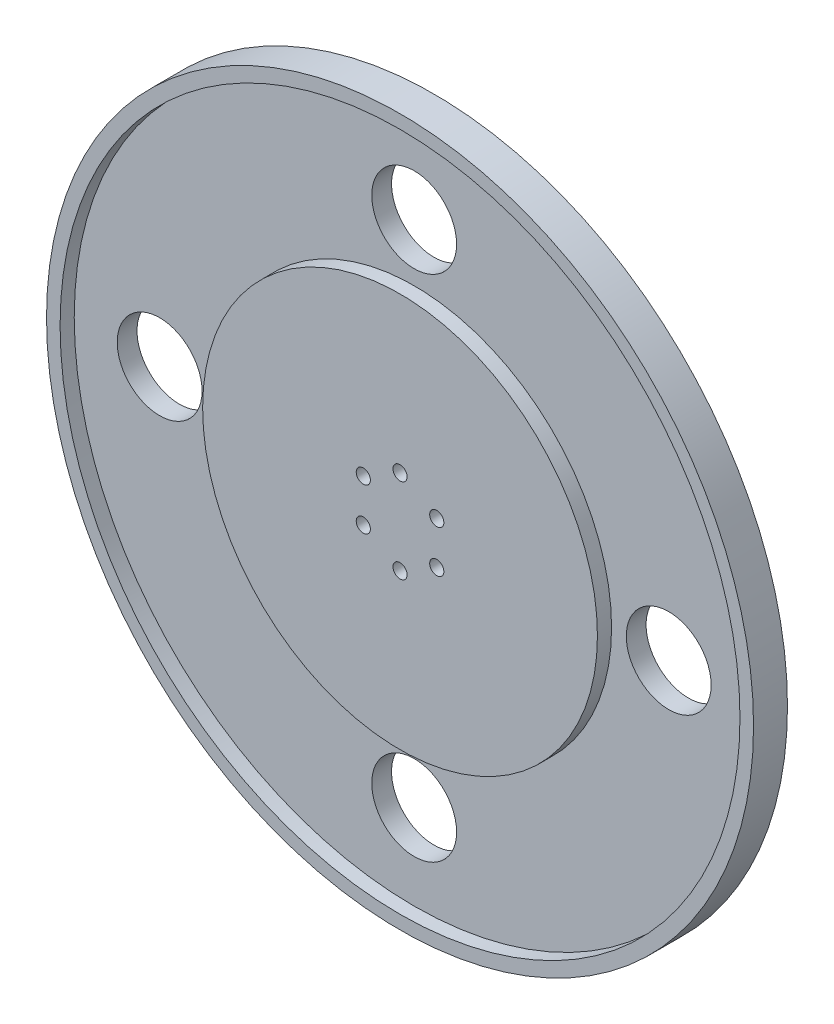
ISO-10303-21;
HEADER;
FILE_DESCRIPTION(('STEP AP214'),'2;1');
FILE_NAME('part.step','',(''),(''),'','','');
FILE_SCHEMA(('AUTOMOTIVE_DESIGN { 1 0 10303 214 1 1 1 1 }'));
ENDSEC;
DATA;
#1=APPLICATION_CONTEXT('core data for automotive mechanical design processes');
#2=APPLICATION_PROTOCOL_DEFINITION('international standard','automotive_design',2000,#1);
#3=PRODUCT_CONTEXT('',#1,'mechanical');
#4=PRODUCT('Part','Part','',(#3));
#5=PRODUCT_RELATED_PRODUCT_CATEGORY('part','',(#4));
#6=PRODUCT_DEFINITION_FORMATION('','',#4);
#7=PRODUCT_DEFINITION_CONTEXT('part definition',#1,'design');
#8=PRODUCT_DEFINITION('design','',#6,#7);
#9=PRODUCT_DEFINITION_SHAPE('','',#8);
#10=(LENGTH_UNIT() NAMED_UNIT(*) SI_UNIT(.MILLI.,.METRE.));
#11=(NAMED_UNIT(*) PLANE_ANGLE_UNIT() SI_UNIT($,.RADIAN.));
#12=(NAMED_UNIT(*) SI_UNIT($,.STERADIAN.) SOLID_ANGLE_UNIT());
#13=UNCERTAINTY_MEASURE_WITH_UNIT(LENGTH_MEASURE(1.E-05),#10,'distance_accuracy_value','');
#14=(GEOMETRIC_REPRESENTATION_CONTEXT(3) GLOBAL_UNCERTAINTY_ASSIGNED_CONTEXT((#13)) GLOBAL_UNIT_ASSIGNED_CONTEXT((#10,
#11,#12)) REPRESENTATION_CONTEXT('',''));
#15=CARTESIAN_POINT('',(0.,0.,0.));
#16=DIRECTION('',(0.,0.,1.));
#17=DIRECTION('',(1.,0.,0.));
#18=AXIS2_PLACEMENT_3D('',#15,#16,#17);
#19=CARTESIAN_POINT('',(0.,0.,7.62));
#20=DIRECTION('',(0.,0.,-1.));
#21=DIRECTION('',(-1.,0.,0.));
#22=AXIS2_PLACEMENT_3D('',#19,#20,#21);
#23=CYLINDRICAL_SURFACE('',#22,44.323);
#24=CARTESIAN_POINT('',(0.,0.,4.445));
#25=DIRECTION('',(0.,0.,1.));
#26=DIRECTION('',(1.,0.,0.));
#27=AXIS2_PLACEMENT_3D('',#24,#25,#26);
#28=CIRCLE('',#27,44.323);
#29=CARTESIAN_POINT('',(-44.323,0.,4.445));
#30=VERTEX_POINT('',#29);
#31=EDGE_CURVE('E49',#30,#30,#28,.T.);
#32=CARTESIAN_POINT('',(0.,0.,7.62));
#33=DIRECTION('',(0.,0.,1.));
#34=DIRECTION('',(1.,0.,0.));
#35=AXIS2_PLACEMENT_3D('',#32,#33,#34);
#36=CIRCLE('',#35,44.323);
#37=CARTESIAN_POINT('',(-44.323,0.,7.62));
#38=VERTEX_POINT('',#37);
#39=EDGE_CURVE('E11',#38,#38,#36,.T.);
#40=CARTESIAN_POINT('',(-44.323,0.,4.445));
#41=CARTESIAN_POINT('',(-44.323,0.,4.47807291666667));
#42=CARTESIAN_POINT('',(-44.323,0.,4.51114583333333));
#43=CARTESIAN_POINT('',(-44.323,0.,4.57729166666667));
#44=CARTESIAN_POINT('',(-44.323,0.,4.61036458333333));
#45=CARTESIAN_POINT('',(-44.323,0.,4.67651041666667));
#46=CARTESIAN_POINT('',(-44.323,0.,4.70958333333333));
#47=CARTESIAN_POINT('',(-44.323,0.,4.77572916666667));
#48=CARTESIAN_POINT('',(-44.323,0.,4.80880208333333));
#49=CARTESIAN_POINT('',(-44.323,0.,4.87494791666667));
#50=CARTESIAN_POINT('',(-44.323,0.,4.90802083333333));
#51=CARTESIAN_POINT('',(-44.323,0.,4.97416666666667));
#52=CARTESIAN_POINT('',(-44.323,0.,5.00723958333333));
#53=CARTESIAN_POINT('',(-44.323,0.,5.07338541666667));
#54=CARTESIAN_POINT('',(-44.323,0.,5.10645833333333));
#55=CARTESIAN_POINT('',(-44.323,0.,5.17260416666667));
#56=CARTESIAN_POINT('',(-44.323,0.,5.20567708333333));
#57=CARTESIAN_POINT('',(-44.323,0.,5.27182291666667));
#58=CARTESIAN_POINT('',(-44.323,0.,5.30489583333333));
#59=CARTESIAN_POINT('',(-44.323,0.,5.37104166666667));
#60=CARTESIAN_POINT('',(-44.323,0.,5.40411458333333));
#61=CARTESIAN_POINT('',(-44.323,0.,5.47026041666667));
#62=CARTESIAN_POINT('',(-44.323,0.,5.50333333333333));
#63=CARTESIAN_POINT('',(-44.323,0.,5.56947916666667));
#64=CARTESIAN_POINT('',(-44.323,0.,5.60255208333333));
#65=CARTESIAN_POINT('',(-44.323,0.,5.66869791666667));
#66=CARTESIAN_POINT('',(-44.323,0.,5.70177083333333));
#67=CARTESIAN_POINT('',(-44.323,0.,5.76791666666667));
#68=CARTESIAN_POINT('',(-44.323,0.,5.80098958333333));
#69=CARTESIAN_POINT('',(-44.323,0.,5.86713541666667));
#70=CARTESIAN_POINT('',(-44.323,0.,5.90020833333333));
#71=CARTESIAN_POINT('',(-44.323,0.,5.96635416666667));
#72=CARTESIAN_POINT('',(-44.323,0.,5.99942708333333));
#73=CARTESIAN_POINT('',(-44.323,0.,6.06557291666667));
#74=CARTESIAN_POINT('',(-44.323,0.,6.09864583333333));
#75=CARTESIAN_POINT('',(-44.323,0.,6.16479166666667));
#76=CARTESIAN_POINT('',(-44.323,0.,6.19786458333333));
#77=CARTESIAN_POINT('',(-44.323,0.,6.26401041666667));
#78=CARTESIAN_POINT('',(-44.323,0.,6.29708333333333));
#79=CARTESIAN_POINT('',(-44.323,0.,6.36322916666667));
#80=CARTESIAN_POINT('',(-44.323,0.,6.39630208333333));
#81=CARTESIAN_POINT('',(-44.323,0.,6.46244791666667));
#82=CARTESIAN_POINT('',(-44.323,0.,6.49552083333333));
#83=CARTESIAN_POINT('',(-44.323,0.,6.56166666666667));
#84=CARTESIAN_POINT('',(-44.323,0.,6.59473958333333));
#85=CARTESIAN_POINT('',(-44.323,0.,6.66088541666667));
#86=CARTESIAN_POINT('',(-44.323,0.,6.69395833333333));
#87=CARTESIAN_POINT('',(-44.323,0.,6.76010416666667));
#88=CARTESIAN_POINT('',(-44.323,0.,6.79317708333333));
#89=CARTESIAN_POINT('',(-44.323,0.,6.85932291666667));
#90=CARTESIAN_POINT('',(-44.323,0.,6.89239583333333));
#91=CARTESIAN_POINT('',(-44.323,0.,6.95854166666667));
#92=CARTESIAN_POINT('',(-44.323,0.,6.99161458333333));
#93=CARTESIAN_POINT('',(-44.323,0.,7.05776041666667));
#94=CARTESIAN_POINT('',(-44.323,0.,7.09083333333333));
#95=CARTESIAN_POINT('',(-44.323,0.,7.15697916666667));
#96=CARTESIAN_POINT('',(-44.323,0.,7.19005208333333));
#97=CARTESIAN_POINT('',(-44.323,0.,7.25619791666667));
#98=CARTESIAN_POINT('',(-44.323,0.,7.28927083333333));
#99=CARTESIAN_POINT('',(-44.323,0.,7.35541666666667));
#100=CARTESIAN_POINT('',(-44.323,0.,7.38848958333333));
#101=CARTESIAN_POINT('',(-44.323,0.,7.45463541666667));
#102=CARTESIAN_POINT('',(-44.323,0.,7.48770833333333));
#103=CARTESIAN_POINT('',(-44.323,0.,7.55385416666667));
#104=CARTESIAN_POINT('',(-44.323,0.,7.58692708333333));
#105=CARTESIAN_POINT('',(-44.323,0.,7.62));
#106=B_SPLINE_CURVE_WITH_KNOTS('',3,(#40,#41,#42,#43,#44,#45,#46,#47,#48,#49,#50,#51,#52,#53,
#54,#55,#56,#57,#58,#59,#60,#61,#62,#63,#64,#65,#66,#67,#68,#69,#70,#71,#72,#73,#74,#75,#76,#77,
#78,#79,#80,#81,#82,#83,#84,#85,#86,#87,#88,#89,#90,#91,#92,#93,#94,#95,#96,#97,#98,#99,#100,
#101,#102,#103,#104,#105),.UNSPECIFIED.,.F.,.F.,(4,2,2,2,2,2,2,2,2,2,2,2,2,2,2,2,2,2,2,2,2,2,2,
2,2,2,2,2,2,2,2,2,4),(0.,0.0992187499999995,0.198437499999999,0.29765625,0.396875,
0.496093749999999,0.595312499999999,0.69453125,0.793749999999999,0.89296875,0.9921875,
1.09140625,1.190625,1.28984375,1.3890625,1.48828125,1.5875,1.68671875,1.7859375,1.88515625,
1.984375,2.08359375,2.1828125,2.28203125,2.38125,2.48046875,2.5796875,2.67890625,2.778125,
2.87734375,2.9765625,3.07578125,3.175),.UNSPECIFIED.);
#107=EDGE_CURVE('BSEAM43',#30,#38,#106,.T.);
#108=ORIENTED_EDGE('',*,*,#31,.T.);
#109=ORIENTED_EDGE('',*,*,#39,.F.);
#110=ORIENTED_EDGE('',*,*,#107,.T.);
#111=ORIENTED_EDGE('',*,*,#107,.F.);
#112=EDGE_LOOP('',(#108,#110,#109,#111));
#113=FACE_BOUND('',#112,.T.);
#114=ADVANCED_FACE('F43',(#113),#23,.T.);
#115=CARTESIAN_POINT('',(0.,0.,7.62));
#116=DIRECTION('',(0.,0.,1.));
#117=DIRECTION('',(1.,0.,0.));
#118=AXIS2_PLACEMENT_3D('',#115,#116,#117);
#119=PLANE('',#118);
#120=CARTESIAN_POINT('',(0.,9.525,7.62));
#121=DIRECTION('',(0.,0.,1.));
#122=DIRECTION('',(1.,0.,0.));
#123=AXIS2_PLACEMENT_3D('',#120,#121,#122);
#124=CIRCLE('',#123,1.5875);
#125=CARTESIAN_POINT('',(1.5875,9.525,7.62));
#126=VERTEX_POINT('',#125);
#127=EDGE_CURVE('E92',#126,#126,#124,.T.);
#128=ORIENTED_EDGE('',*,*,#127,.F.);
#129=EDGE_LOOP('',(#128));
#130=FACE_BOUND('',#129,.T.);
#131=CARTESIAN_POINT('',(-8.24889197104678,4.76249999999999,7.62));
#132=DIRECTION('',(0.,0.,1.));
#133=DIRECTION('',(1.,0.,0.));
#134=AXIS2_PLACEMENT_3D('',#131,#132,#133);
#135=CIRCLE('',#134,1.5875);
#136=CARTESIAN_POINT('',(-6.66139197104678,4.76249999999999,7.62));
#137=VERTEX_POINT('',#136);
#138=EDGE_CURVE('E97',#137,#137,#135,.T.);
#139=ORIENTED_EDGE('',*,*,#138,.F.);
#140=EDGE_LOOP('',(#139));
#141=FACE_BOUND('',#140,.T.);
#142=CARTESIAN_POINT('',(-8.24889197104678,-4.7625,7.62));
#143=DIRECTION('',(0.,0.,1.));
#144=DIRECTION('',(1.,0.,0.));
#145=AXIS2_PLACEMENT_3D('',#142,#143,#144);
#146=CIRCLE('',#145,1.5875);
#147=CARTESIAN_POINT('',(-6.66139197104678,-4.7625,7.62));
#148=VERTEX_POINT('',#147);
#149=EDGE_CURVE('E73',#148,#148,#146,.T.);
#150=ORIENTED_EDGE('',*,*,#149,.F.);
#151=EDGE_LOOP('',(#150));
#152=FACE_BOUND('',#151,.T.);
#153=CARTESIAN_POINT('',(0.,-9.525,7.62));
#154=DIRECTION('',(0.,0.,1.));
#155=DIRECTION('',(1.,0.,0.));
#156=AXIS2_PLACEMENT_3D('',#153,#154,#155);
#157=CIRCLE('',#156,1.5875);
#158=CARTESIAN_POINT('',(1.5875,-9.525,7.62));
#159=VERTEX_POINT('',#158);
#160=EDGE_CURVE('E72',#159,#159,#157,.T.);
#161=ORIENTED_EDGE('',*,*,#160,.F.);
#162=EDGE_LOOP('',(#161));
#163=FACE_BOUND('',#162,.T.);
#164=CARTESIAN_POINT('',(8.24889197104678,-4.7625,7.62));
#165=DIRECTION('',(0.,0.,1.));
#166=DIRECTION('',(1.,0.,0.));
#167=AXIS2_PLACEMENT_3D('',#164,#165,#166);
#168=CIRCLE('',#167,1.5875);
#169=CARTESIAN_POINT('',(9.83639197104678,-4.7625,7.62));
#170=VERTEX_POINT('',#169);
#171=EDGE_CURVE('E80',#170,#170,#168,.T.);
#172=ORIENTED_EDGE('',*,*,#171,.F.);
#173=EDGE_LOOP('',(#172));
#174=FACE_BOUND('',#173,.T.);
#175=CARTESIAN_POINT('',(8.24889197104678,4.7625,7.62));
#176=DIRECTION('',(0.,0.,1.));
#177=DIRECTION('',(1.,0.,0.));
#178=AXIS2_PLACEMENT_3D('',#175,#176,#177);
#179=CIRCLE('',#178,1.5875);
#180=CARTESIAN_POINT('',(9.83639197104678,4.7625,7.62));
#181=VERTEX_POINT('',#180);
#182=EDGE_CURVE('E86',#181,#181,#179,.T.);
#183=ORIENTED_EDGE('',*,*,#182,.F.);
#184=EDGE_LOOP('',(#183));
#185=FACE_BOUND('',#184,.T.);
#186=ORIENTED_EDGE('',*,*,#39,.T.);
#187=EDGE_LOOP('',(#186));
#188=FACE_BOUND('',#187,.T.);
#189=ADVANCED_FACE('F136',(#130,#141,#152,#163,#174,#185,#188),#119,.T.);
#190=CARTESIAN_POINT('',(0.,0.,4.445));
#191=DIRECTION('',(0.,0.,1.));
#192=DIRECTION('',(1.,0.,0.));
#193=AXIS2_PLACEMENT_3D('',#190,#191,#192);
#194=PLANE('',#193);
#195=CARTESIAN_POINT('',(0.,57.15,4.445));
#196=DIRECTION('',(0.,0.,1.));
#197=DIRECTION('',(1.,0.,0.));
#198=AXIS2_PLACEMENT_3D('',#195,#196,#197);
#199=CIRCLE('',#198,9.525);
#200=CARTESIAN_POINT('',(9.525,57.15,4.445));
#201=VERTEX_POINT('',#200);
#202=EDGE_CURVE('E121',#201,#201,#199,.T.);
#203=ORIENTED_EDGE('',*,*,#202,.F.);
#204=EDGE_LOOP('',(#203));
#205=FACE_BOUND('',#204,.T.);
#206=CARTESIAN_POINT('',(57.15,-1.99538158514885E-13,4.445));
#207=DIRECTION('',(0.,0.,1.));
#208=DIRECTION('',(1.,0.,0.));
#209=AXIS2_PLACEMENT_3D('',#206,#207,#208);
#210=CIRCLE('',#209,9.525);
#211=CARTESIAN_POINT('',(66.675,-1.99538158514885E-13,4.445));
#212=VERTEX_POINT('',#211);
#213=EDGE_CURVE('E115',#212,#212,#210,.T.);
#214=ORIENTED_EDGE('',*,*,#213,.F.);
#215=EDGE_LOOP('',(#214));
#216=FACE_BOUND('',#215,.T.);
#217=CARTESIAN_POINT('',(1.61030298103333E-12,-57.15,4.445));
#218=DIRECTION('',(0.,0.,1.));
#219=DIRECTION('',(1.,0.,0.));
#220=AXIS2_PLACEMENT_3D('',#217,#218,#219);
#221=CIRCLE('',#220,9.52500000000192);
#222=CARTESIAN_POINT('',(9.52500000000353,-57.15,4.445));
#223=VERTEX_POINT('',#222);
#224=EDGE_CURVE('E108',#223,#223,#221,.T.);
#225=ORIENTED_EDGE('',*,*,#224,.F.);
#226=EDGE_LOOP('',(#225));
#227=FACE_BOUND('',#226,.T.);
#228=CARTESIAN_POINT('',(-57.1499999999992,-8.12150346973795E-13,4.445));
#229=DIRECTION('',(0.,0.,1.));
#230=DIRECTION('',(1.,0.,0.));
#231=AXIS2_PLACEMENT_3D('',#228,#229,#230);
#232=CIRCLE('',#231,9.52500000000158);
#233=CARTESIAN_POINT('',(-47.6249999999976,-8.12150346973795E-13,4.445));
#234=VERTEX_POINT('',#233);
#235=EDGE_CURVE('E109',#234,#234,#232,.T.);
#236=ORIENTED_EDGE('',*,*,#235,.F.);
#237=EDGE_LOOP('',(#236));
#238=FACE_BOUND('',#237,.T.);
#239=ORIENTED_EDGE('',*,*,#31,.F.);
#240=EDGE_LOOP('',(#239));
#241=FACE_BOUND('',#240,.T.);
#242=CARTESIAN_POINT('',(0.,0.,4.445));
#243=DIRECTION('',(0.,0.,1.));
#244=DIRECTION('',(1.,0.,0.));
#245=AXIS2_PLACEMENT_3D('',#242,#243,#244);
#246=CIRCLE('',#245,76.327);
#247=CARTESIAN_POINT('',(-76.327,0.,4.445));
#248=VERTEX_POINT('',#247);
#249=EDGE_CURVE('E53',#248,#248,#246,.F.);
#250=ORIENTED_EDGE('',*,*,#249,.F.);
#251=EDGE_LOOP('',(#250));
#252=FACE_BOUND('',#251,.T.);
#253=ADVANCED_FACE('F132',(#205,#216,#227,#238,#241,#252),#194,.T.);
#254=CARTESIAN_POINT('',(0.,0.,7.62));
#255=DIRECTION('',(0.,0.,-1.));
#256=DIRECTION('',(-1.,0.,0.));
#257=AXIS2_PLACEMENT_3D('',#254,#255,#256);
#258=CYLINDRICAL_SURFACE('',#257,76.327);
#259=CARTESIAN_POINT('',(0.,0.,7.62));
#260=DIRECTION('',(0.,0.,1.));
#261=DIRECTION('',(1.,0.,0.));
#262=AXIS2_PLACEMENT_3D('',#259,#260,#261);
#263=CIRCLE('',#262,76.327);
#264=CARTESIAN_POINT('',(-76.327,0.,7.62));
#265=VERTEX_POINT('',#264);
#266=EDGE_CURVE('E63',#265,#265,#263,.T.);
#267=CARTESIAN_POINT('',(-76.327,0.,4.445));
#268=CARTESIAN_POINT('',(-76.327,0.,4.47807291666667));
#269=CARTESIAN_POINT('',(-76.327,0.,4.51114583333333));
#270=CARTESIAN_POINT('',(-76.327,0.,4.57729166666667));
#271=CARTESIAN_POINT('',(-76.327,0.,4.61036458333333));
#272=CARTESIAN_POINT('',(-76.327,0.,4.67651041666667));
#273=CARTESIAN_POINT('',(-76.327,0.,4.70958333333333));
#274=CARTESIAN_POINT('',(-76.327,0.,4.77572916666667));
#275=CARTESIAN_POINT('',(-76.327,0.,4.80880208333333));
#276=CARTESIAN_POINT('',(-76.327,0.,4.87494791666667));
#277=CARTESIAN_POINT('',(-76.327,0.,4.90802083333333));
#278=CARTESIAN_POINT('',(-76.327,0.,4.97416666666667));
#279=CARTESIAN_POINT('',(-76.327,0.,5.00723958333333));
#280=CARTESIAN_POINT('',(-76.327,0.,5.07338541666667));
#281=CARTESIAN_POINT('',(-76.327,0.,5.10645833333333));
#282=CARTESIAN_POINT('',(-76.327,0.,5.17260416666667));
#283=CARTESIAN_POINT('',(-76.327,0.,5.20567708333333));
#284=CARTESIAN_POINT('',(-76.327,0.,5.27182291666667));
#285=CARTESIAN_POINT('',(-76.327,0.,5.30489583333333));
#286=CARTESIAN_POINT('',(-76.327,0.,5.37104166666667));
#287=CARTESIAN_POINT('',(-76.327,0.,5.40411458333333));
#288=CARTESIAN_POINT('',(-76.327,0.,5.47026041666667));
#289=CARTESIAN_POINT('',(-76.327,0.,5.50333333333333));
#290=CARTESIAN_POINT('',(-76.327,0.,5.56947916666667));
#291=CARTESIAN_POINT('',(-76.327,0.,5.60255208333333));
#292=CARTESIAN_POINT('',(-76.327,0.,5.66869791666667));
#293=CARTESIAN_POINT('',(-76.327,0.,5.70177083333333));
#294=CARTESIAN_POINT('',(-76.327,0.,5.76791666666667));
#295=CARTESIAN_POINT('',(-76.327,0.,5.80098958333333));
#296=CARTESIAN_POINT('',(-76.327,0.,5.86713541666667));
#297=CARTESIAN_POINT('',(-76.327,0.,5.90020833333333));
#298=CARTESIAN_POINT('',(-76.327,0.,5.96635416666667));
#299=CARTESIAN_POINT('',(-76.327,0.,5.99942708333333));
#300=CARTESIAN_POINT('',(-76.327,0.,6.06557291666667));
#301=CARTESIAN_POINT('',(-76.327,0.,6.09864583333333));
#302=CARTESIAN_POINT('',(-76.327,0.,6.16479166666667));
#303=CARTESIAN_POINT('',(-76.327,0.,6.19786458333333));
#304=CARTESIAN_POINT('',(-76.327,0.,6.26401041666667));
#305=CARTESIAN_POINT('',(-76.327,0.,6.29708333333333));
#306=CARTESIAN_POINT('',(-76.327,0.,6.36322916666667));
#307=CARTESIAN_POINT('',(-76.327,0.,6.39630208333333));
#308=CARTESIAN_POINT('',(-76.327,0.,6.46244791666667));
#309=CARTESIAN_POINT('',(-76.327,0.,6.49552083333333));
#310=CARTESIAN_POINT('',(-76.327,0.,6.56166666666667));
#311=CARTESIAN_POINT('',(-76.327,0.,6.59473958333333));
#312=CARTESIAN_POINT('',(-76.327,0.,6.66088541666667));
#313=CARTESIAN_POINT('',(-76.327,0.,6.69395833333333));
#314=CARTESIAN_POINT('',(-76.327,0.,6.76010416666667));
#315=CARTESIAN_POINT('',(-76.327,0.,6.79317708333333));
#316=CARTESIAN_POINT('',(-76.327,0.,6.85932291666667));
#317=CARTESIAN_POINT('',(-76.327,0.,6.89239583333333));
#318=CARTESIAN_POINT('',(-76.327,0.,6.95854166666667));
#319=CARTESIAN_POINT('',(-76.327,0.,6.99161458333333));
#320=CARTESIAN_POINT('',(-76.327,0.,7.05776041666667));
#321=CARTESIAN_POINT('',(-76.327,0.,7.09083333333333));
#322=CARTESIAN_POINT('',(-76.327,0.,7.15697916666667));
#323=CARTESIAN_POINT('',(-76.327,0.,7.19005208333333));
#324=CARTESIAN_POINT('',(-76.327,0.,7.25619791666667));
#325=CARTESIAN_POINT('',(-76.327,0.,7.28927083333333));
#326=CARTESIAN_POINT('',(-76.327,0.,7.35541666666667));
#327=CARTESIAN_POINT('',(-76.327,0.,7.38848958333333));
#328=CARTESIAN_POINT('',(-76.327,0.,7.45463541666667));
#329=CARTESIAN_POINT('',(-76.327,0.,7.48770833333333));
#330=CARTESIAN_POINT('',(-76.327,0.,7.55385416666667));
#331=CARTESIAN_POINT('',(-76.327,0.,7.58692708333333));
#332=CARTESIAN_POINT('',(-76.327,0.,7.62));
#333=B_SPLINE_CURVE_WITH_KNOTS('',3,(#267,#268,#269,#270,#271,#272,#273,#274,#275,#276,#277,
#278,#279,#280,#281,#282,#283,#284,#285,#286,#287,#288,#289,#290,#291,#292,#293,#294,#295,#296,
#297,#298,#299,#300,#301,#302,#303,#304,#305,#306,#307,#308,#309,#310,#311,#312,#313,#314,#315,
#316,#317,#318,#319,#320,#321,#322,#323,#324,#325,#326,#327,#328,#329,#330,#331,#332),
.UNSPECIFIED.,.F.,.F.,(4,2,2,2,2,2,2,2,2,2,2,2,2,2,2,2,2,2,2,2,2,2,2,2,2,2,2,2,2,2,2,2,4),(0.,
0.0992187499999995,0.198437499999999,0.29765625,0.396875,0.496093749999999,0.595312499999999,
0.69453125,0.793749999999999,0.89296875,0.9921875,1.09140625,1.190625,1.28984375,1.3890625,
1.48828125,1.5875,1.68671875,1.7859375,1.88515625,1.984375,2.08359375,2.1828125,2.28203125,
2.38125,2.48046875,2.5796875,2.67890625,2.778125,2.87734375,2.9765625,3.07578125,3.175),.UNSPECIFIED.);
#334=EDGE_CURVE('BSEAM135',#248,#265,#333,.T.);
#335=ORIENTED_EDGE('',*,*,#249,.T.);
#336=ORIENTED_EDGE('',*,*,#266,.T.);
#337=ORIENTED_EDGE('',*,*,#334,.T.);
#338=ORIENTED_EDGE('',*,*,#334,.F.);
#339=EDGE_LOOP('',(#335,#337,#336,#338));
#340=FACE_BOUND('',#339,.T.);
#341=ADVANCED_FACE('F135',(#340),#258,.F.);
#342=CARTESIAN_POINT('',(0.,0.,7.62));
#343=DIRECTION('',(0.,0.,-1.));
#344=DIRECTION('',(-1.,0.,0.));
#345=AXIS2_PLACEMENT_3D('',#342,#343,#344);
#346=CYLINDRICAL_SURFACE('',#345,79.375);
#347=CARTESIAN_POINT('',(0.,0.,7.62));
#348=DIRECTION('',(0.,0.,1.));
#349=DIRECTION('',(1.,0.,0.));
#350=AXIS2_PLACEMENT_3D('',#347,#348,#349);
#351=CIRCLE('',#350,79.375);
#352=CARTESIAN_POINT('',(-79.375,0.,7.62));
#353=VERTEX_POINT('',#352);
#354=EDGE_CURVE('E57',#353,#353,#351,.T.);
#355=CARTESIAN_POINT('',(0.,0.,0.));
#356=DIRECTION('',(0.,0.,1.));
#357=DIRECTION('',(1.,0.,0.));
#358=AXIS2_PLACEMENT_3D('',#355,#356,#357);
#359=CIRCLE('',#358,79.375);
#360=CARTESIAN_POINT('',(-79.375,0.,0.));
#361=VERTEX_POINT('',#360);
#362=EDGE_CURVE('E60',#361,#361,#359,.T.);
#363=CARTESIAN_POINT('',(-79.375,0.,7.62));
#364=CARTESIAN_POINT('',(-79.375,0.,7.540625));
#365=CARTESIAN_POINT('',(-79.375,0.,7.46125));
#366=CARTESIAN_POINT('',(-79.375,0.,7.3025));
#367=CARTESIAN_POINT('',(-79.375,0.,7.223125));
#368=CARTESIAN_POINT('',(-79.375,0.,7.064375));
#369=CARTESIAN_POINT('',(-79.375,0.,6.985));
#370=CARTESIAN_POINT('',(-79.375,0.,6.82625));
#371=CARTESIAN_POINT('',(-79.375,0.,6.746875));
#372=CARTESIAN_POINT('',(-79.375,0.,6.588125));
#373=CARTESIAN_POINT('',(-79.375,0.,6.50875));
#374=CARTESIAN_POINT('',(-79.375,0.,6.35));
#375=CARTESIAN_POINT('',(-79.375,0.,6.270625));
#376=CARTESIAN_POINT('',(-79.375,0.,6.111875));
#377=CARTESIAN_POINT('',(-79.375,0.,6.0325));
#378=CARTESIAN_POINT('',(-79.375,0.,5.87375));
#379=CARTESIAN_POINT('',(-79.375,0.,5.794375));
#380=CARTESIAN_POINT('',(-79.375,0.,5.635625));
#381=CARTESIAN_POINT('',(-79.375,0.,5.55625));
#382=CARTESIAN_POINT('',(-79.375,0.,5.3975));
#383=CARTESIAN_POINT('',(-79.375,0.,5.318125));
#384=CARTESIAN_POINT('',(-79.375,0.,5.159375));
#385=CARTESIAN_POINT('',(-79.375,0.,5.08));
#386=CARTESIAN_POINT('',(-79.375,0.,4.92125));
#387=CARTESIAN_POINT('',(-79.375,0.,4.841875));
#388=CARTESIAN_POINT('',(-79.375,0.,4.683125));
#389=CARTESIAN_POINT('',(-79.375,0.,4.60375));
#390=CARTESIAN_POINT('',(-79.375,0.,4.445));
#391=CARTESIAN_POINT('',(-79.375,0.,4.365625));
#392=CARTESIAN_POINT('',(-79.375,0.,4.206875));
#393=CARTESIAN_POINT('',(-79.375,0.,4.1275));
#394=CARTESIAN_POINT('',(-79.375,0.,3.96875));
#395=CARTESIAN_POINT('',(-79.375,0.,3.889375));
#396=CARTESIAN_POINT('',(-79.375,0.,3.730625));
#397=CARTESIAN_POINT('',(-79.375,0.,3.65125));
#398=CARTESIAN_POINT('',(-79.375,0.,3.4925));
#399=CARTESIAN_POINT('',(-79.375,0.,3.413125));
#400=CARTESIAN_POINT('',(-79.375,0.,3.254375));
#401=CARTESIAN_POINT('',(-79.375,0.,3.175));
#402=CARTESIAN_POINT('',(-79.375,0.,3.01625));
#403=CARTESIAN_POINT('',(-79.375,0.,2.936875));
#404=CARTESIAN_POINT('',(-79.375,0.,2.778125));
#405=CARTESIAN_POINT('',(-79.375,0.,2.69875));
#406=CARTESIAN_POINT('',(-79.375,0.,2.54));
#407=CARTESIAN_POINT('',(-79.375,0.,2.460625));
#408=CARTESIAN_POINT('',(-79.375,0.,2.301875));
#409=CARTESIAN_POINT('',(-79.375,0.,2.2225));
#410=CARTESIAN_POINT('',(-79.375,0.,2.06375));
#411=CARTESIAN_POINT('',(-79.375,0.,1.984375));
#412=CARTESIAN_POINT('',(-79.375,0.,1.825625));
#413=CARTESIAN_POINT('',(-79.375,0.,1.74625));
#414=CARTESIAN_POINT('',(-79.375,0.,1.5875));
#415=CARTESIAN_POINT('',(-79.375,0.,1.508125));
#416=CARTESIAN_POINT('',(-79.375,0.,1.349375));
#417=CARTESIAN_POINT('',(-79.375,0.,1.27));
#418=CARTESIAN_POINT('',(-79.375,0.,1.11125));
#419=CARTESIAN_POINT('',(-79.375,0.,1.031875));
#420=CARTESIAN_POINT('',(-79.375,0.,0.873125));
#421=CARTESIAN_POINT('',(-79.375,0.,0.79375));
#422=CARTESIAN_POINT('',(-79.375,0.,0.635));
#423=CARTESIAN_POINT('',(-79.375,0.,0.555625));
#424=CARTESIAN_POINT('',(-79.375,0.,0.396875));
#425=CARTESIAN_POINT('',(-79.375,0.,0.3175));
#426=CARTESIAN_POINT('',(-79.375,0.,0.15875));
#427=CARTESIAN_POINT('',(-79.375,0.,0.0793749999999999));
#428=CARTESIAN_POINT('',(-79.375,0.,0.));
#429=B_SPLINE_CURVE_WITH_KNOTS('',3,(#363,#364,#365,#366,#367,#368,#369,#370,#371,#372,#373,
#374,#375,#376,#377,#378,#379,#380,#381,#382,#383,#384,#385,#386,#387,#388,#389,#390,#391,#392,
#393,#394,#395,#396,#397,#398,#399,#400,#401,#402,#403,#404,#405,#406,#407,#408,#409,#410,#411,
#412,#413,#414,#415,#416,#417,#418,#419,#420,#421,#422,#423,#424,#425,#426,#427,#428),
.UNSPECIFIED.,.F.,.F.,(4,2,2,2,2,2,2,2,2,2,2,2,2,2,2,2,2,2,2,2,2,2,2,2,2,2,2,2,2,2,2,2,4),(0.,
0.238125,0.476249999999999,0.714375,0.952499999999999,1.190625,1.42875,1.666875,1.905,2.143125,
2.38125,2.619375,2.8575,3.095625,3.33375,3.571875,3.81,4.048125,4.28625,4.524375,4.7625,
5.000625,5.23875,5.476875,5.715,5.953125,6.19125,6.429375,6.6675,6.905625,7.14375,7.381875,
7.62),.UNSPECIFIED.);
#430=EDGE_CURVE('BSEAM149',#353,#361,#429,.T.);
#431=ORIENTED_EDGE('',*,*,#354,.F.);
#432=ORIENTED_EDGE('',*,*,#362,.T.);
#433=ORIENTED_EDGE('',*,*,#430,.T.);
#434=ORIENTED_EDGE('',*,*,#430,.F.);
#435=EDGE_LOOP('',(#431,#433,#432,#434));
#436=FACE_BOUND('',#435,.T.);
#437=ADVANCED_FACE('F149',(#436),#346,.T.);
#438=CARTESIAN_POINT('',(0.,0.,7.62));
#439=DIRECTION('',(0.,0.,1.));
#440=DIRECTION('',(1.,0.,0.));
#441=AXIS2_PLACEMENT_3D('',#438,#439,#440);
#442=PLANE('',#441);
#443=ORIENTED_EDGE('',*,*,#266,.F.);
#444=EDGE_LOOP('',(#443));
#445=FACE_BOUND('',#444,.T.);
#446=ORIENTED_EDGE('',*,*,#354,.T.);
#447=EDGE_LOOP('',(#446));
#448=FACE_BOUND('',#447,.T.);
#449=ADVANCED_FACE('F153',(#445,#448),#442,.T.);
#450=CARTESIAN_POINT('',(0.,0.,0.));
#451=DIRECTION('',(0.,0.,1.));
#452=DIRECTION('',(1.,0.,0.));
#453=AXIS2_PLACEMENT_3D('',#450,#451,#452);
#454=PLANE('',#453);
#455=CARTESIAN_POINT('',(0.,57.15,0.));
#456=DIRECTION('',(0.,0.,1.));
#457=DIRECTION('',(1.,0.,0.));
#458=AXIS2_PLACEMENT_3D('',#455,#456,#457);
#459=CIRCLE('',#458,9.525);
#460=CARTESIAN_POINT('',(9.525,57.15,0.));
#461=VERTEX_POINT('',#460);
#462=EDGE_CURVE('E100',#461,#461,#459,.F.);
#463=ORIENTED_EDGE('',*,*,#462,.F.);
#464=EDGE_LOOP('',(#463));
#465=FACE_BOUND('',#464,.T.);
#466=CARTESIAN_POINT('',(57.15,-1.99538158514885E-13,0.));
#467=DIRECTION('',(0.,0.,1.));
#468=DIRECTION('',(1.,0.,0.));
#469=AXIS2_PLACEMENT_3D('',#466,#467,#468);
#470=CIRCLE('',#469,9.525);
#471=CARTESIAN_POINT('',(66.675,-1.99538158514885E-13,0.));
#472=VERTEX_POINT('',#471);
#473=EDGE_CURVE('E118',#472,#472,#470,.F.);
#474=ORIENTED_EDGE('',*,*,#473,.F.);
#475=EDGE_LOOP('',(#474));
#476=FACE_BOUND('',#475,.T.);
#477=CARTESIAN_POINT('',(1.61030298103333E-12,-57.15,0.));
#478=DIRECTION('',(0.,0.,1.));
#479=DIRECTION('',(1.,0.,0.));
#480=AXIS2_PLACEMENT_3D('',#477,#478,#479);
#481=CIRCLE('',#480,9.52500000000192);
#482=CARTESIAN_POINT('',(9.52500000000353,-57.15,0.));
#483=VERTEX_POINT('',#482);
#484=EDGE_CURVE('E112',#483,#483,#481,.F.);
#485=ORIENTED_EDGE('',*,*,#484,.F.);
#486=EDGE_LOOP('',(#485));
#487=FACE_BOUND('',#486,.T.);
#488=CARTESIAN_POINT('',(-57.1499999999992,-8.12150346973795E-13,0.));
#489=DIRECTION('',(0.,0.,1.));
#490=DIRECTION('',(1.,0.,0.));
#491=AXIS2_PLACEMENT_3D('',#488,#489,#490);
#492=CIRCLE('',#491,9.52500000000158);
#493=CARTESIAN_POINT('',(-47.6249999999976,-8.12150346973795E-13,0.));
#494=VERTEX_POINT('',#493);
#495=EDGE_CURVE('E105',#494,#494,#492,.F.);
#496=ORIENTED_EDGE('',*,*,#495,.F.);
#497=EDGE_LOOP('',(#496));
#498=FACE_BOUND('',#497,.T.);
#499=CARTESIAN_POINT('',(0.,9.525,0.));
#500=DIRECTION('',(0.,0.,1.));
#501=DIRECTION('',(1.,0.,0.));
#502=AXIS2_PLACEMENT_3D('',#499,#500,#501);
#503=CIRCLE('',#502,1.5875);
#504=CARTESIAN_POINT('',(1.5875,9.525,0.));
#505=VERTEX_POINT('',#504);
#506=EDGE_CURVE('E64',#505,#505,#503,.F.);
#507=ORIENTED_EDGE('',*,*,#506,.F.);
#508=EDGE_LOOP('',(#507));
#509=FACE_BOUND('',#508,.T.);
#510=CARTESIAN_POINT('',(-8.24889197104678,4.76249999999999,0.));
#511=DIRECTION('',(0.,0.,1.));
#512=DIRECTION('',(1.,0.,0.));
#513=AXIS2_PLACEMENT_3D('',#510,#511,#512);
#514=CIRCLE('',#513,1.5875);
#515=CARTESIAN_POINT('',(-6.66139197104678,4.76249999999999,0.));
#516=VERTEX_POINT('',#515);
#517=EDGE_CURVE('E76',#516,#516,#514,.F.);
#518=ORIENTED_EDGE('',*,*,#517,.F.);
#519=EDGE_LOOP('',(#518));
#520=FACE_BOUND('',#519,.T.);
#521=CARTESIAN_POINT('',(-8.24889197104678,-4.7625,0.));
#522=DIRECTION('',(0.,0.,1.));
#523=DIRECTION('',(1.,0.,0.));
#524=AXIS2_PLACEMENT_3D('',#521,#522,#523);
#525=CIRCLE('',#524,1.5875);
#526=CARTESIAN_POINT('',(-6.66139197104678,-4.7625,0.));
#527=VERTEX_POINT('',#526);
#528=EDGE_CURVE('E69',#527,#527,#525,.F.);
#529=ORIENTED_EDGE('',*,*,#528,.F.);
#530=EDGE_LOOP('',(#529));
#531=FACE_BOUND('',#530,.T.);
#532=CARTESIAN_POINT('',(0.,-9.525,0.));
#533=DIRECTION('',(0.,0.,1.));
#534=DIRECTION('',(1.,0.,0.));
#535=AXIS2_PLACEMENT_3D('',#532,#533,#534);
#536=CIRCLE('',#535,1.5875);
#537=CARTESIAN_POINT('',(1.5875,-9.525,0.));
#538=VERTEX_POINT('',#537);
#539=EDGE_CURVE('E77',#538,#538,#536,.F.);
#540=ORIENTED_EDGE('',*,*,#539,.F.);
#541=EDGE_LOOP('',(#540));
#542=FACE_BOUND('',#541,.T.);
#543=CARTESIAN_POINT('',(8.24889197104678,-4.7625,0.));
#544=DIRECTION('',(0.,0.,1.));
#545=DIRECTION('',(1.,0.,0.));
#546=AXIS2_PLACEMENT_3D('',#543,#544,#545);
#547=CIRCLE('',#546,1.5875);
#548=CARTESIAN_POINT('',(9.83639197104678,-4.7625,0.));
#549=VERTEX_POINT('',#548);
#550=EDGE_CURVE('E83',#549,#549,#547,.F.);
#551=ORIENTED_EDGE('',*,*,#550,.F.);
#552=EDGE_LOOP('',(#551));
#553=FACE_BOUND('',#552,.T.);
#554=CARTESIAN_POINT('',(8.24889197104678,4.7625,0.));
#555=DIRECTION('',(0.,0.,1.));
#556=DIRECTION('',(1.,0.,0.));
#557=AXIS2_PLACEMENT_3D('',#554,#555,#556);
#558=CIRCLE('',#557,1.5875);
#559=CARTESIAN_POINT('',(9.83639197104678,4.7625,0.));
#560=VERTEX_POINT('',#559);
#561=EDGE_CURVE('E89',#560,#560,#558,.F.);
#562=ORIENTED_EDGE('',*,*,#561,.F.);
#563=EDGE_LOOP('',(#562));
#564=FACE_BOUND('',#563,.T.);
#565=ORIENTED_EDGE('',*,*,#362,.F.);
#566=EDGE_LOOP('',(#565));
#567=FACE_BOUND('',#566,.T.);
#568=ADVANCED_FACE('F156',(#465,#476,#487,#498,#509,#520,#531,#542,#553,#564,#567),#454,.F.);
#569=CARTESIAN_POINT('',(8.24889197104678,4.7625,-0.00100000000000013));
#570=DIRECTION('',(0.,0.,1.));
#571=DIRECTION('',(1.,0.,0.));
#572=AXIS2_PLACEMENT_3D('',#569,#570,#571);
#573=CYLINDRICAL_SURFACE('',#572,1.5875);
#574=ORIENTED_EDGE('',*,*,#182,.T.);
#575=EDGE_LOOP('',(#574));
#576=FACE_BOUND('',#575,.T.);
#577=ORIENTED_EDGE('',*,*,#561,.T.);
#578=EDGE_LOOP('',(#577));
#579=FACE_BOUND('',#578,.T.);
#580=ADVANCED_FACE('F166',(#576,#579),#573,.F.);
#581=CARTESIAN_POINT('',(8.24889197104678,-4.7625,-0.00100000000000013));
#582=DIRECTION('',(0.,0.,1.));
#583=DIRECTION('',(1.,0.,0.));
#584=AXIS2_PLACEMENT_3D('',#581,#582,#583);
#585=CYLINDRICAL_SURFACE('',#584,1.5875);
#586=ORIENTED_EDGE('',*,*,#171,.T.);
#587=EDGE_LOOP('',(#586));
#588=FACE_BOUND('',#587,.T.);
#589=ORIENTED_EDGE('',*,*,#550,.T.);
#590=EDGE_LOOP('',(#589));
#591=FACE_BOUND('',#590,.T.);
#592=ADVANCED_FACE('F172',(#588,#591),#585,.F.);
#593=CARTESIAN_POINT('',(0.,-9.525,-0.00100000000000013));
#594=DIRECTION('',(0.,0.,1.));
#595=DIRECTION('',(1.,0.,0.));
#596=AXIS2_PLACEMENT_3D('',#593,#594,#595);
#597=CYLINDRICAL_SURFACE('',#596,1.5875);
#598=ORIENTED_EDGE('',*,*,#160,.T.);
#599=EDGE_LOOP('',(#598));
#600=FACE_BOUND('',#599,.T.);
#601=ORIENTED_EDGE('',*,*,#539,.T.);
#602=EDGE_LOOP('',(#601));
#603=FACE_BOUND('',#602,.T.);
#604=ADVANCED_FACE('F194',(#600,#603),#597,.F.);
#605=CARTESIAN_POINT('',(-8.24889197104678,-4.7625,-0.00100000000000013));
#606=DIRECTION('',(0.,0.,1.));
#607=DIRECTION('',(1.,0.,0.));
#608=AXIS2_PLACEMENT_3D('',#605,#606,#607);
#609=CYLINDRICAL_SURFACE('',#608,1.5875);
#610=ORIENTED_EDGE('',*,*,#149,.T.);
#611=EDGE_LOOP('',(#610));
#612=FACE_BOUND('',#611,.T.);
#613=ORIENTED_EDGE('',*,*,#528,.T.);
#614=EDGE_LOOP('',(#613));
#615=FACE_BOUND('',#614,.T.);
#616=ADVANCED_FACE('F190',(#612,#615),#609,.F.);
#617=CARTESIAN_POINT('',(-8.24889197104678,4.76249999999999,-0.00100000000000013));
#618=DIRECTION('',(0.,0.,1.));
#619=DIRECTION('',(1.,0.,0.));
#620=AXIS2_PLACEMENT_3D('',#617,#618,#619);
#621=CYLINDRICAL_SURFACE('',#620,1.5875);
#622=ORIENTED_EDGE('',*,*,#138,.T.);
#623=EDGE_LOOP('',(#622));
#624=FACE_BOUND('',#623,.T.);
#625=ORIENTED_EDGE('',*,*,#517,.T.);
#626=EDGE_LOOP('',(#625));
#627=FACE_BOUND('',#626,.T.);
#628=ADVANCED_FACE('F193',(#624,#627),#621,.F.);
#629=CARTESIAN_POINT('',(0.,9.525,-0.00100000000000013));
#630=DIRECTION('',(0.,0.,1.));
#631=DIRECTION('',(1.,0.,0.));
#632=AXIS2_PLACEMENT_3D('',#629,#630,#631);
#633=CYLINDRICAL_SURFACE('',#632,1.5875);
#634=ORIENTED_EDGE('',*,*,#127,.T.);
#635=EDGE_LOOP('',(#634));
#636=FACE_BOUND('',#635,.T.);
#637=ORIENTED_EDGE('',*,*,#506,.T.);
#638=EDGE_LOOP('',(#637));
#639=FACE_BOUND('',#638,.T.);
#640=ADVANCED_FACE('F204',(#636,#639),#633,.F.);
#641=CARTESIAN_POINT('',(-57.1499999999992,-8.12150346973795E-13,-0.00100000000000013));
#642=DIRECTION('',(0.,0.,1.));
#643=DIRECTION('',(1.,0.,0.));
#644=AXIS2_PLACEMENT_3D('',#641,#642,#643);
#645=CYLINDRICAL_SURFACE('',#644,9.52500000000158);
#646=ORIENTED_EDGE('',*,*,#235,.T.);
#647=EDGE_LOOP('',(#646));
#648=FACE_BOUND('',#647,.T.);
#649=ORIENTED_EDGE('',*,*,#495,.T.);
#650=EDGE_LOOP('',(#649));
#651=FACE_BOUND('',#650,.T.);
#652=ADVANCED_FACE('F208',(#648,#651),#645,.F.);
#653=CARTESIAN_POINT('',(1.61030298103333E-12,-57.15,-0.00100000000000013));
#654=DIRECTION('',(0.,0.,1.));
#655=DIRECTION('',(1.,0.,0.));
#656=AXIS2_PLACEMENT_3D('',#653,#654,#655);
#657=CYLINDRICAL_SURFACE('',#656,9.52500000000192);
#658=ORIENTED_EDGE('',*,*,#224,.T.);
#659=EDGE_LOOP('',(#658));
#660=FACE_BOUND('',#659,.T.);
#661=ORIENTED_EDGE('',*,*,#484,.T.);
#662=EDGE_LOOP('',(#661));
#663=FACE_BOUND('',#662,.T.);
#664=ADVANCED_FACE('F212',(#660,#663),#657,.F.);
#665=CARTESIAN_POINT('',(57.15,-1.99538158514885E-13,-0.00100000000000013));
#666=DIRECTION('',(0.,0.,1.));
#667=DIRECTION('',(1.,0.,0.));
#668=AXIS2_PLACEMENT_3D('',#665,#666,#667);
#669=CYLINDRICAL_SURFACE('',#668,9.525);
#670=ORIENTED_EDGE('',*,*,#213,.T.);
#671=EDGE_LOOP('',(#670));
#672=FACE_BOUND('',#671,.T.);
#673=ORIENTED_EDGE('',*,*,#473,.T.);
#674=EDGE_LOOP('',(#673));
#675=FACE_BOUND('',#674,.T.);
#676=ADVANCED_FACE('F216',(#672,#675),#669,.F.);
#677=CARTESIAN_POINT('',(0.,57.15,-0.00100000000000013));
#678=DIRECTION('',(0.,0.,1.));
#679=DIRECTION('',(1.,0.,0.));
#680=AXIS2_PLACEMENT_3D('',#677,#678,#679);
#681=CYLINDRICAL_SURFACE('',#680,9.525);
#682=ORIENTED_EDGE('',*,*,#202,.T.);
#683=EDGE_LOOP('',(#682));
#684=FACE_BOUND('',#683,.T.);
#685=ORIENTED_EDGE('',*,*,#462,.T.);
#686=EDGE_LOOP('',(#685));
#687=FACE_BOUND('',#686,.T.);
#688=ADVANCED_FACE('F129',(#684,#687),#681,.F.);
#689=CLOSED_SHELL('',(#114,#189,#253,#341,#437,#449,#568,#580,#592,#604,#616,#628,#640,#652,
#664,#676,#688));
#690=MANIFOLD_SOLID_BREP('B2',#689);
#691=ADVANCED_BREP_SHAPE_REPRESENTATION('',(#18,#690),#14);
#692=SHAPE_DEFINITION_REPRESENTATION(#9,#691);
ENDSEC;
END-ISO-10303-21;
